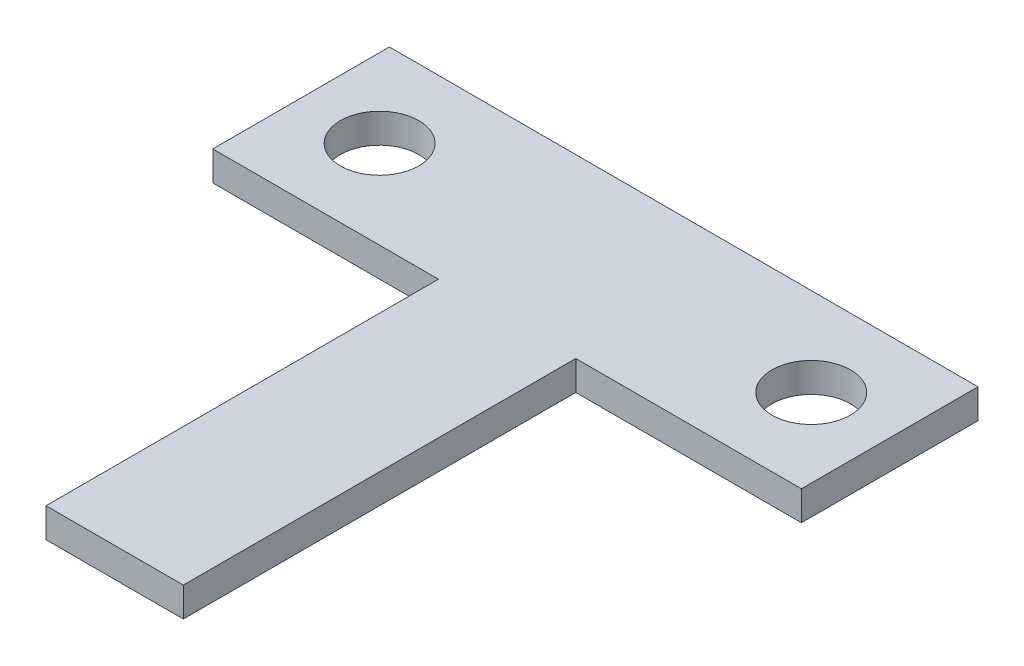
ISO-10303-21;
HEADER;
FILE_DESCRIPTION(('STEP AP214'),'2;1');
FILE_NAME('part.step','',(''),(''),'','','');
FILE_SCHEMA(('AUTOMOTIVE_DESIGN { 1 0 10303 214 1 1 1 1 }'));
ENDSEC;
DATA;
#1=APPLICATION_CONTEXT('core data for automotive mechanical design processes');
#2=APPLICATION_PROTOCOL_DEFINITION('international standard','automotive_design',2000,#1);
#3=PRODUCT_CONTEXT('',#1,'mechanical');
#4=PRODUCT('Part','Part','',(#3));
#5=PRODUCT_RELATED_PRODUCT_CATEGORY('part','',(#4));
#6=PRODUCT_DEFINITION_FORMATION('','',#4);
#7=PRODUCT_DEFINITION_CONTEXT('part definition',#1,'design');
#8=PRODUCT_DEFINITION('design','',#6,#7);
#9=PRODUCT_DEFINITION_SHAPE('','',#8);
#10=(LENGTH_UNIT() NAMED_UNIT(*) SI_UNIT(.MILLI.,.METRE.));
#11=(NAMED_UNIT(*) PLANE_ANGLE_UNIT() SI_UNIT($,.RADIAN.));
#12=(NAMED_UNIT(*) SI_UNIT($,.STERADIAN.) SOLID_ANGLE_UNIT());
#13=UNCERTAINTY_MEASURE_WITH_UNIT(LENGTH_MEASURE(1.E-05),#10,'distance_accuracy_value','');
#14=(GEOMETRIC_REPRESENTATION_CONTEXT(3) GLOBAL_UNCERTAINTY_ASSIGNED_CONTEXT((#13)) GLOBAL_UNIT_ASSIGNED_CONTEXT((#10,
#11,#12)) REPRESENTATION_CONTEXT('',''));
#15=CARTESIAN_POINT('',(0.,0.,0.));
#16=DIRECTION('',(0.,0.,1.));
#17=DIRECTION('',(1.,0.,0.));
#18=AXIS2_PLACEMENT_3D('',#15,#16,#17);
#19=CARTESIAN_POINT('',(0.,1.5,0.));
#20=DIRECTION('',(0.,1.,0.));
#21=DIRECTION('',(0.,0.,1.));
#22=AXIS2_PLACEMENT_3D('',#19,#20,#21);
#23=PLANE('',#22);
#24=CARTESIAN_POINT('',(11.,1.5,0.));
#25=DIRECTION('',(0.,1.,0.));
#26=DIRECTION('',(0.,0.,1.));
#27=AXIS2_PLACEMENT_3D('',#24,#25,#26);
#28=CIRCLE('',#27,2.);
#29=CARTESIAN_POINT('',(11.,1.5,2.));
#30=VERTEX_POINT('',#29);
#31=EDGE_CURVE('E135',#30,#30,#28,.T.);
#32=ORIENTED_EDGE('',*,*,#31,.F.);
#33=EDGE_LOOP('',(#32));
#34=FACE_BOUND('',#33,.T.);
#35=DIRECTION('',(0.,0.,1.));
#36=VECTOR('',#35,1.);
#37=CARTESIAN_POINT('',(-3.5,1.5,4.5));
#38=LINE('',#37,#36);
#39=CARTESIAN_POINT('',(-3.5,1.5,4.5));
#40=VERTEX_POINT('',#39);
#41=CARTESIAN_POINT('',(-3.49999999999999,1.5,24.5));
#42=VERTEX_POINT('',#41);
#43=EDGE_CURVE('E146',#40,#42,#38,.T.);
#44=ORIENTED_EDGE('',*,*,#43,.T.);
#45=DIRECTION('',(1.,0.,0.));
#46=VECTOR('',#45,1.);
#47=CARTESIAN_POINT('',(-3.49999999999999,1.5,24.5));
#48=LINE('',#47,#46);
#49=CARTESIAN_POINT('',(3.50000000000001,1.5,24.5));
#50=VERTEX_POINT('',#49);
#51=EDGE_CURVE('E94',#42,#50,#48,.T.);
#52=ORIENTED_EDGE('',*,*,#51,.T.);
#53=DIRECTION('',(0.,0.,-1.));
#54=VECTOR('',#53,1.);
#55=CARTESIAN_POINT('',(3.5,1.5,4.5));
#56=LINE('',#55,#54);
#57=CARTESIAN_POINT('',(3.5,1.5,4.5));
#58=VERTEX_POINT('',#57);
#59=EDGE_CURVE('E161',#50,#58,#56,.T.);
#60=ORIENTED_EDGE('',*,*,#59,.T.);
#61=DIRECTION('',(1.,0.,0.));
#62=VECTOR('',#61,1.);
#63=CARTESIAN_POINT('',(3.5,1.5,4.5));
#64=LINE('',#63,#62);
#65=CARTESIAN_POINT('',(15.,1.5,4.5));
#66=VERTEX_POINT('',#65);
#67=EDGE_CURVE('E174',#58,#66,#64,.T.);
#68=ORIENTED_EDGE('',*,*,#67,.T.);
#69=DIRECTION('',(0.,0.,-1.));
#70=VECTOR('',#69,1.);
#71=CARTESIAN_POINT('',(15.,1.5,4.5));
#72=LINE('',#71,#70);
#73=CARTESIAN_POINT('',(15.,1.5,-4.5));
#74=VERTEX_POINT('',#73);
#75=EDGE_CURVE('E113',#66,#74,#72,.T.);
#76=ORIENTED_EDGE('',*,*,#75,.T.);
#77=DIRECTION('',(-1.,0.,0.));
#78=VECTOR('',#77,1.);
#79=CARTESIAN_POINT('',(-15.,1.5,-4.5));
#80=LINE('',#79,#78);
#81=CARTESIAN_POINT('',(-15.,1.5,-4.5));
#82=VERTEX_POINT('',#81);
#83=EDGE_CURVE('E107',#74,#82,#80,.T.);
#84=ORIENTED_EDGE('',*,*,#83,.T.);
#85=DIRECTION('',(0.,0.,1.));
#86=VECTOR('',#85,1.);
#87=CARTESIAN_POINT('',(-15.,1.5,4.5));
#88=LINE('',#87,#86);
#89=CARTESIAN_POINT('',(-15.,1.5,4.5));
#90=VERTEX_POINT('',#89);
#91=EDGE_CURVE('E111',#82,#90,#88,.T.);
#92=ORIENTED_EDGE('',*,*,#91,.T.);
#93=DIRECTION('',(1.,0.,0.));
#94=VECTOR('',#93,1.);
#95=CARTESIAN_POINT('',(-15.,1.5,4.5));
#96=LINE('',#95,#94);
#97=EDGE_CURVE('E51',#90,#40,#96,.T.);
#98=ORIENTED_EDGE('',*,*,#97,.T.);
#99=EDGE_LOOP('',(#44,#52,#60,#68,#76,#84,#92,#98));
#100=FACE_BOUND('',#99,.T.);
#101=CARTESIAN_POINT('',(-11.,1.5,0.));
#102=DIRECTION('',(0.,1.,0.));
#103=DIRECTION('',(0.,0.,-1.));
#104=AXIS2_PLACEMENT_3D('',#101,#102,#103);
#105=CIRCLE('',#104,2.);
#106=CARTESIAN_POINT('',(-11.,1.5,-2.));
#107=VERTEX_POINT('',#106);
#108=EDGE_CURVE('E183',#107,#107,#105,.T.);
#109=ORIENTED_EDGE('',*,*,#108,.F.);
#110=EDGE_LOOP('',(#109));
#111=FACE_BOUND('',#110,.T.);
#112=ADVANCED_FACE('F34',(#34,#100,#111),#23,.T.);
#113=CARTESIAN_POINT('',(0.,0.,0.));
#114=DIRECTION('',(0.,1.,0.));
#115=DIRECTION('',(0.,0.,1.));
#116=AXIS2_PLACEMENT_3D('',#113,#114,#115);
#117=PLANE('',#116);
#118=DIRECTION('',(0.,0.,1.));
#119=VECTOR('',#118,1.);
#120=CARTESIAN_POINT('',(-3.5,0.,4.5));
#121=LINE('',#120,#119);
#122=CARTESIAN_POINT('',(-3.5,0.,4.5));
#123=VERTEX_POINT('',#122);
#124=CARTESIAN_POINT('',(-3.49999999999999,0.,24.5));
#125=VERTEX_POINT('',#124);
#126=EDGE_CURVE('E131',#123,#125,#121,.T.);
#127=ORIENTED_EDGE('',*,*,#126,.F.);
#128=DIRECTION('',(1.,0.,0.));
#129=VECTOR('',#128,1.);
#130=CARTESIAN_POINT('',(-15.,0.,4.5));
#131=LINE('',#130,#129);
#132=CARTESIAN_POINT('',(-15.,0.,4.5));
#133=VERTEX_POINT('',#132);
#134=EDGE_CURVE('E86',#133,#123,#131,.T.);
#135=ORIENTED_EDGE('',*,*,#134,.F.);
#136=DIRECTION('',(0.,0.,1.));
#137=VECTOR('',#136,1.);
#138=CARTESIAN_POINT('',(-15.,0.,4.5));
#139=LINE('',#138,#137);
#140=CARTESIAN_POINT('',(-15.,0.,-4.5));
#141=VERTEX_POINT('',#140);
#142=EDGE_CURVE('E80',#141,#133,#139,.T.);
#143=ORIENTED_EDGE('',*,*,#142,.F.);
#144=DIRECTION('',(-1.,0.,0.));
#145=VECTOR('',#144,1.);
#146=CARTESIAN_POINT('',(-15.,0.,-4.5));
#147=LINE('',#146,#145);
#148=CARTESIAN_POINT('',(15.,0.,-4.5));
#149=VERTEX_POINT('',#148);
#150=EDGE_CURVE('E121',#149,#141,#147,.T.);
#151=ORIENTED_EDGE('',*,*,#150,.F.);
#152=DIRECTION('',(0.,0.,-1.));
#153=VECTOR('',#152,1.);
#154=CARTESIAN_POINT('',(15.,0.,4.5));
#155=LINE('',#154,#153);
#156=CARTESIAN_POINT('',(15.,0.,4.5));
#157=VERTEX_POINT('',#156);
#158=EDGE_CURVE('E141',#157,#149,#155,.T.);
#159=ORIENTED_EDGE('',*,*,#158,.F.);
#160=DIRECTION('',(1.,0.,0.));
#161=VECTOR('',#160,1.);
#162=CARTESIAN_POINT('',(3.5,0.,4.5));
#163=LINE('',#162,#161);
#164=CARTESIAN_POINT('',(3.5,0.,4.5));
#165=VERTEX_POINT('',#164);
#166=EDGE_CURVE('E139',#165,#157,#163,.T.);
#167=ORIENTED_EDGE('',*,*,#166,.F.);
#168=DIRECTION('',(0.,0.,-1.));
#169=VECTOR('',#168,1.);
#170=CARTESIAN_POINT('',(3.5,0.,4.5));
#171=LINE('',#170,#169);
#172=CARTESIAN_POINT('',(3.50000000000001,0.,24.5));
#173=VERTEX_POINT('',#172);
#174=EDGE_CURVE('E137',#173,#165,#171,.T.);
#175=ORIENTED_EDGE('',*,*,#174,.F.);
#176=DIRECTION('',(1.,0.,0.));
#177=VECTOR('',#176,1.);
#178=CARTESIAN_POINT('',(-3.49999999999999,0.,24.5));
#179=LINE('',#178,#177);
#180=EDGE_CURVE('E134',#125,#173,#179,.T.);
#181=ORIENTED_EDGE('',*,*,#180,.F.);
#182=EDGE_LOOP('',(#127,#135,#143,#151,#159,#167,#175,#181));
#183=FACE_BOUND('',#182,.T.);
#184=CARTESIAN_POINT('',(11.,0.,0.));
#185=DIRECTION('',(0.,1.,0.));
#186=DIRECTION('',(0.,0.,1.));
#187=AXIS2_PLACEMENT_3D('',#184,#185,#186);
#188=CIRCLE('',#187,2.);
#189=CARTESIAN_POINT('',(11.,0.,2.));
#190=VERTEX_POINT('',#189);
#191=EDGE_CURVE('E180',#190,#190,#188,.T.);
#192=ORIENTED_EDGE('',*,*,#191,.T.);
#193=EDGE_LOOP('',(#192));
#194=FACE_BOUND('',#193,.T.);
#195=CARTESIAN_POINT('',(-11.,0.,0.));
#196=DIRECTION('',(0.,1.,0.));
#197=DIRECTION('',(0.,0.,-1.));
#198=AXIS2_PLACEMENT_3D('',#195,#196,#197);
#199=CIRCLE('',#198,2.);
#200=CARTESIAN_POINT('',(-11.,0.,-2.));
#201=VERTEX_POINT('',#200);
#202=EDGE_CURVE('E186',#201,#201,#199,.T.);
#203=ORIENTED_EDGE('',*,*,#202,.T.);
#204=EDGE_LOOP('',(#203));
#205=FACE_BOUND('',#204,.T.);
#206=ADVANCED_FACE('F165',(#183,#194,#205),#117,.F.);
#207=CARTESIAN_POINT('',(-3.5,1.5,4.5));
#208=DIRECTION('',(1.,0.,0.));
#209=DIRECTION('',(0.,0.,-1.));
#210=AXIS2_PLACEMENT_3D('',#207,#208,#209);
#211=PLANE('',#210);
#212=ORIENTED_EDGE('',*,*,#126,.T.);
#213=DIRECTION('',(0.,-1.,0.));
#214=VECTOR('',#213,1.);
#215=CARTESIAN_POINT('',(-3.49999999999999,1.5,24.5));
#216=LINE('',#215,#214);
#217=EDGE_CURVE('E11',#42,#125,#216,.T.);
#218=ORIENTED_EDGE('',*,*,#217,.F.);
#219=ORIENTED_EDGE('',*,*,#43,.F.);
#220=DIRECTION('',(0.,-1.,0.));
#221=VECTOR('',#220,1.);
#222=CARTESIAN_POINT('',(-3.5,1.5,4.5));
#223=LINE('',#222,#221);
#224=EDGE_CURVE('E127',#40,#123,#223,.T.);
#225=ORIENTED_EDGE('',*,*,#224,.T.);
#226=EDGE_LOOP('',(#212,#218,#219,#225));
#227=FACE_BOUND('',#226,.T.);
#228=ADVANCED_FACE('F36',(#227),#211,.F.);
#229=CARTESIAN_POINT('',(-3.49999999999999,1.5,24.5));
#230=DIRECTION('',(0.,0.,-1.));
#231=DIRECTION('',(-1.,0.,0.));
#232=AXIS2_PLACEMENT_3D('',#229,#230,#231);
#233=PLANE('',#232);
#234=ORIENTED_EDGE('',*,*,#180,.T.);
#235=DIRECTION('',(0.,-1.,0.));
#236=VECTOR('',#235,1.);
#237=CARTESIAN_POINT('',(3.50000000000001,1.5,24.5));
#238=LINE('',#237,#236);
#239=EDGE_CURVE('E43',#50,#173,#238,.T.);
#240=ORIENTED_EDGE('',*,*,#239,.F.);
#241=ORIENTED_EDGE('',*,*,#51,.F.);
#242=ORIENTED_EDGE('',*,*,#217,.T.);
#243=EDGE_LOOP('',(#234,#240,#241,#242));
#244=FACE_BOUND('',#243,.T.);
#245=ADVANCED_FACE('F218',(#244),#233,.F.);
#246=CARTESIAN_POINT('',(3.5,1.5,4.5));
#247=DIRECTION('',(-1.,0.,0.));
#248=DIRECTION('',(0.,0.,1.));
#249=AXIS2_PLACEMENT_3D('',#246,#247,#248);
#250=PLANE('',#249);
#251=ORIENTED_EDGE('',*,*,#174,.T.);
#252=DIRECTION('',(0.,-1.,0.));
#253=VECTOR('',#252,1.);
#254=CARTESIAN_POINT('',(3.5,1.5,4.5));
#255=LINE('',#254,#253);
#256=EDGE_CURVE('E153',#58,#165,#255,.T.);
#257=ORIENTED_EDGE('',*,*,#256,.F.);
#258=ORIENTED_EDGE('',*,*,#59,.F.);
#259=ORIENTED_EDGE('',*,*,#239,.T.);
#260=EDGE_LOOP('',(#251,#257,#258,#259));
#261=FACE_BOUND('',#260,.T.);
#262=ADVANCED_FACE('F159',(#261),#250,.F.);
#263=CARTESIAN_POINT('',(3.5,1.5,4.5));
#264=DIRECTION('',(0.,0.,-1.));
#265=DIRECTION('',(-1.,0.,0.));
#266=AXIS2_PLACEMENT_3D('',#263,#264,#265);
#267=PLANE('',#266);
#268=ORIENTED_EDGE('',*,*,#166,.T.);
#269=DIRECTION('',(0.,-1.,0.));
#270=VECTOR('',#269,1.);
#271=CARTESIAN_POINT('',(15.,1.5,4.5));
#272=LINE('',#271,#270);
#273=EDGE_CURVE('E150',#66,#157,#272,.T.);
#274=ORIENTED_EDGE('',*,*,#273,.F.);
#275=ORIENTED_EDGE('',*,*,#67,.F.);
#276=ORIENTED_EDGE('',*,*,#256,.T.);
#277=EDGE_LOOP('',(#268,#274,#275,#276));
#278=FACE_BOUND('',#277,.T.);
#279=ADVANCED_FACE('F170',(#278),#267,.F.);
#280=CARTESIAN_POINT('',(15.,1.5,4.5));
#281=DIRECTION('',(-1.,0.,0.));
#282=DIRECTION('',(0.,0.,1.));
#283=AXIS2_PLACEMENT_3D('',#280,#281,#282);
#284=PLANE('',#283);
#285=ORIENTED_EDGE('',*,*,#158,.T.);
#286=DIRECTION('',(0.,-1.,0.));
#287=VECTOR('',#286,1.);
#288=CARTESIAN_POINT('',(15.,1.5,-4.5));
#289=LINE('',#288,#287);
#290=EDGE_CURVE('E122',#74,#149,#289,.T.);
#291=ORIENTED_EDGE('',*,*,#290,.F.);
#292=ORIENTED_EDGE('',*,*,#75,.F.);
#293=ORIENTED_EDGE('',*,*,#273,.T.);
#294=EDGE_LOOP('',(#285,#291,#292,#293));
#295=FACE_BOUND('',#294,.T.);
#296=ADVANCED_FACE('F173',(#295),#284,.F.);
#297=CARTESIAN_POINT('',(-15.,1.5,-4.5));
#298=DIRECTION('',(0.,0.,1.));
#299=DIRECTION('',(1.,0.,0.));
#300=AXIS2_PLACEMENT_3D('',#297,#298,#299);
#301=PLANE('',#300);
#302=ORIENTED_EDGE('',*,*,#150,.T.);
#303=DIRECTION('',(0.,-1.,0.));
#304=VECTOR('',#303,1.);
#305=CARTESIAN_POINT('',(-15.,1.5,-4.5));
#306=LINE('',#305,#304);
#307=EDGE_CURVE('E118',#82,#141,#306,.T.);
#308=ORIENTED_EDGE('',*,*,#307,.F.);
#309=ORIENTED_EDGE('',*,*,#83,.F.);
#310=ORIENTED_EDGE('',*,*,#290,.T.);
#311=EDGE_LOOP('',(#302,#308,#309,#310));
#312=FACE_BOUND('',#311,.T.);
#313=ADVANCED_FACE('F119',(#312),#301,.F.);
#314=CARTESIAN_POINT('',(-15.,1.5,4.5));
#315=DIRECTION('',(1.,0.,0.));
#316=DIRECTION('',(0.,0.,-1.));
#317=AXIS2_PLACEMENT_3D('',#314,#315,#316);
#318=PLANE('',#317);
#319=ORIENTED_EDGE('',*,*,#142,.T.);
#320=DIRECTION('',(0.,-1.,0.));
#321=VECTOR('',#320,1.);
#322=CARTESIAN_POINT('',(-15.,1.5,4.5));
#323=LINE('',#322,#321);
#324=EDGE_CURVE('E123',#90,#133,#323,.T.);
#325=ORIENTED_EDGE('',*,*,#324,.F.);
#326=ORIENTED_EDGE('',*,*,#91,.F.);
#327=ORIENTED_EDGE('',*,*,#307,.T.);
#328=EDGE_LOOP('',(#319,#325,#326,#327));
#329=FACE_BOUND('',#328,.T.);
#330=ADVANCED_FACE('F125',(#329),#318,.F.);
#331=CARTESIAN_POINT('',(-15.,1.5,4.5));
#332=DIRECTION('',(0.,0.,-1.));
#333=DIRECTION('',(-1.,0.,0.));
#334=AXIS2_PLACEMENT_3D('',#331,#332,#333);
#335=PLANE('',#334);
#336=ORIENTED_EDGE('',*,*,#134,.T.);
#337=ORIENTED_EDGE('',*,*,#224,.F.);
#338=ORIENTED_EDGE('',*,*,#97,.F.);
#339=ORIENTED_EDGE('',*,*,#324,.T.);
#340=EDGE_LOOP('',(#336,#337,#338,#339));
#341=FACE_BOUND('',#340,.T.);
#342=ADVANCED_FACE('F206',(#341),#335,.F.);
#343=CARTESIAN_POINT('',(11.,1.5,0.));
#344=DIRECTION('',(0.,-1.,0.));
#345=DIRECTION('',(0.,0.,-1.));
#346=AXIS2_PLACEMENT_3D('',#343,#344,#345);
#347=CYLINDRICAL_SURFACE('',#346,2.);
#348=ORIENTED_EDGE('',*,*,#31,.T.);
#349=EDGE_LOOP('',(#348));
#350=FACE_BOUND('',#349,.T.);
#351=ORIENTED_EDGE('',*,*,#191,.F.);
#352=EDGE_LOOP('',(#351));
#353=FACE_BOUND('',#352,.T.);
#354=ADVANCED_FACE('F203',(#350,#353),#347,.F.);
#355=CARTESIAN_POINT('',(-11.,1.5,0.));
#356=DIRECTION('',(0.,-1.,0.));
#357=DIRECTION('',(0.,0.,-1.));
#358=AXIS2_PLACEMENT_3D('',#355,#356,#357);
#359=CYLINDRICAL_SURFACE('',#358,2.);
#360=ORIENTED_EDGE('',*,*,#108,.T.);
#361=EDGE_LOOP('',(#360));
#362=FACE_BOUND('',#361,.T.);
#363=ORIENTED_EDGE('',*,*,#202,.F.);
#364=EDGE_LOOP('',(#363));
#365=FACE_BOUND('',#364,.T.);
#366=ADVANCED_FACE('F192',(#362,#365),#359,.F.);
#367=CLOSED_SHELL('',(#112,#206,#228,#245,#262,#279,#296,#313,#330,#342,#354,#366));
#368=MANIFOLD_SOLID_BREP('B2',#367);
#369=ADVANCED_BREP_SHAPE_REPRESENTATION('',(#18,#368),#14);
#370=SHAPE_DEFINITION_REPRESENTATION(#9,#369);
ENDSEC;
END-ISO-10303-21;
